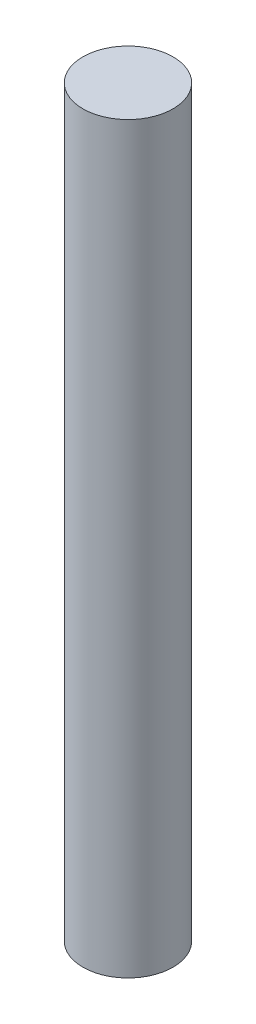
ISO-10303-21;
HEADER;
FILE_DESCRIPTION(('STEP AP214'),'2;1');
FILE_NAME('part.step','',(''),(''),'','','');
FILE_SCHEMA(('AUTOMOTIVE_DESIGN { 1 0 10303 214 1 1 1 1 }'));
ENDSEC;
DATA;
#1=APPLICATION_CONTEXT('core data for automotive mechanical design processes');
#2=APPLICATION_PROTOCOL_DEFINITION('international standard','automotive_design',2000,#1);
#3=PRODUCT_CONTEXT('',#1,'mechanical');
#4=PRODUCT('Part','Part','',(#3));
#5=PRODUCT_RELATED_PRODUCT_CATEGORY('part','',(#4));
#6=PRODUCT_DEFINITION_FORMATION('','',#4);
#7=PRODUCT_DEFINITION_CONTEXT('part definition',#1,'design');
#8=PRODUCT_DEFINITION('design','',#6,#7);
#9=PRODUCT_DEFINITION_SHAPE('','',#8);
#10=(LENGTH_UNIT() NAMED_UNIT(*) SI_UNIT(.MILLI.,.METRE.));
#11=(NAMED_UNIT(*) PLANE_ANGLE_UNIT() SI_UNIT($,.RADIAN.));
#12=(NAMED_UNIT(*) SI_UNIT($,.STERADIAN.) SOLID_ANGLE_UNIT());
#13=UNCERTAINTY_MEASURE_WITH_UNIT(LENGTH_MEASURE(1.E-05),#10,'distance_accuracy_value','');
#14=(GEOMETRIC_REPRESENTATION_CONTEXT(3) GLOBAL_UNCERTAINTY_ASSIGNED_CONTEXT((#13)) GLOBAL_UNIT_ASSIGNED_CONTEXT((#10,
#11,#12)) REPRESENTATION_CONTEXT('',''));
#15=CARTESIAN_POINT('',(0.,0.,0.));
#16=DIRECTION('',(0.,0.,1.));
#17=DIRECTION('',(1.,0.,0.));
#18=AXIS2_PLACEMENT_3D('',#15,#16,#17);
#19=CARTESIAN_POINT('',(0.,80.,0.));
#20=DIRECTION('',(0.,-1.,0.));
#21=DIRECTION('',(0.,0.,-1.));
#22=AXIS2_PLACEMENT_3D('',#19,#20,#21);
#23=CYLINDRICAL_SURFACE('',#22,4.85);
#24=CARTESIAN_POINT('',(0.,80.,0.));
#25=DIRECTION('',(0.,1.,0.));
#26=DIRECTION('',(0.,0.,1.));
#27=AXIS2_PLACEMENT_3D('',#24,#25,#26);
#28=CIRCLE('',#27,4.85);
#29=CARTESIAN_POINT('',(0.,80.,4.85));
#30=VERTEX_POINT('',#29);
#31=EDGE_CURVE('E10',#30,#30,#28,.T.);
#32=ORIENTED_EDGE('',*,*,#31,.F.);
#33=EDGE_LOOP('',(#32));
#34=FACE_BOUND('',#33,.T.);
#35=CARTESIAN_POINT('',(0.,0.,0.));
#36=DIRECTION('',(0.,1.,0.));
#37=DIRECTION('',(0.,0.,1.));
#38=AXIS2_PLACEMENT_3D('',#35,#36,#37);
#39=CIRCLE('',#38,4.85);
#40=CARTESIAN_POINT('',(0.,0.,4.85));
#41=VERTEX_POINT('',#40);
#42=EDGE_CURVE('E37',#41,#41,#39,.T.);
#43=ORIENTED_EDGE('',*,*,#42,.T.);
#44=EDGE_LOOP('',(#43));
#45=FACE_BOUND('',#44,.T.);
#46=ADVANCED_FACE('F34',(#34,#45),#23,.T.);
#47=CARTESIAN_POINT('',(0.,80.,0.));
#48=DIRECTION('',(0.,1.,0.));
#49=DIRECTION('',(0.,0.,1.));
#50=AXIS2_PLACEMENT_3D('',#47,#48,#49);
#51=PLANE('',#50);
#52=ORIENTED_EDGE('',*,*,#31,.T.);
#53=EDGE_LOOP('',(#52));
#54=FACE_BOUND('',#53,.T.);
#55=ADVANCED_FACE('F49',(#54),#51,.T.);
#56=CARTESIAN_POINT('',(0.,0.,0.));
#57=DIRECTION('',(0.,1.,0.));
#58=DIRECTION('',(0.,0.,1.));
#59=AXIS2_PLACEMENT_3D('',#56,#57,#58);
#60=PLANE('',#59);
#61=ORIENTED_EDGE('',*,*,#42,.F.);
#62=EDGE_LOOP('',(#61));
#63=FACE_BOUND('',#62,.T.);
#64=ADVANCED_FACE('F47',(#63),#60,.F.);
#65=CLOSED_SHELL('',(#46,#55,#64));
#66=MANIFOLD_SOLID_BREP('B2',#65);
#67=ADVANCED_BREP_SHAPE_REPRESENTATION('',(#18,#66),#14);
#68=SHAPE_DEFINITION_REPRESENTATION(#9,#67);
ENDSEC;
END-ISO-10303-21;
